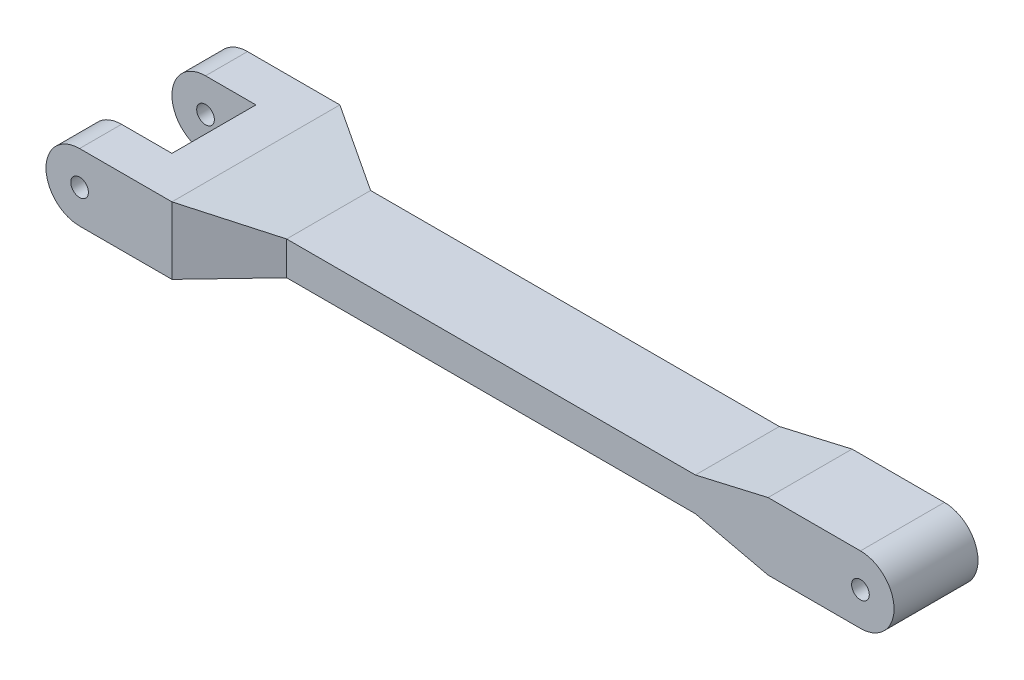
ISO-10303-21;
HEADER;
FILE_DESCRIPTION(('STEP AP214'),'2;1');
FILE_NAME('part.step','',(''),(''),'','','');
FILE_SCHEMA(('AUTOMOTIVE_DESIGN { 1 0 10303 214 1 1 1 1 }'));
ENDSEC;
DATA;
#1=APPLICATION_CONTEXT('core data for automotive mechanical design processes');
#2=APPLICATION_PROTOCOL_DEFINITION('international standard','automotive_design',2000,#1);
#3=PRODUCT_CONTEXT('',#1,'mechanical');
#4=PRODUCT('Part','Part','',(#3));
#5=PRODUCT_RELATED_PRODUCT_CATEGORY('part','',(#4));
#6=PRODUCT_DEFINITION_FORMATION('','',#4);
#7=PRODUCT_DEFINITION_CONTEXT('part definition',#1,'design');
#8=PRODUCT_DEFINITION('design','',#6,#7);
#9=PRODUCT_DEFINITION_SHAPE('','',#8);
#10=(LENGTH_UNIT() NAMED_UNIT(*) SI_UNIT(.MILLI.,.METRE.));
#11=(NAMED_UNIT(*) PLANE_ANGLE_UNIT() SI_UNIT($,.RADIAN.));
#12=(NAMED_UNIT(*) SI_UNIT($,.STERADIAN.) SOLID_ANGLE_UNIT());
#13=UNCERTAINTY_MEASURE_WITH_UNIT(LENGTH_MEASURE(1.E-05),#10,'distance_accuracy_value','');
#14=(GEOMETRIC_REPRESENTATION_CONTEXT(3) GLOBAL_UNCERTAINTY_ASSIGNED_CONTEXT((#13)) GLOBAL_UNIT_ASSIGNED_CONTEXT((#10,
#11,#12)) REPRESENTATION_CONTEXT('',''));
#15=CARTESIAN_POINT('',(0.,0.,0.));
#16=DIRECTION('',(0.,0.,1.));
#17=DIRECTION('',(1.,0.,0.));
#18=AXIS2_PLACEMENT_3D('',#15,#16,#17);
#19=CARTESIAN_POINT('',(-10.7768571428571,-4.0478840909925,25.4));
#20=DIRECTION('',(0.,1.,0.));
#21=DIRECTION('',(0.,0.,1.));
#22=AXIS2_PLACEMENT_3D('',#19,#20,#21);
#23=PLANE('',#22);
#24=DIRECTION('',(0.,0.,1.));
#25=VECTOR('',#24,1.);
#26=CARTESIAN_POINT('',(3.19314285714287,-4.0478840909925,0.));
#27=LINE('',#26,#25);
#28=CARTESIAN_POINT('',(3.19314285714287,-4.0478840909925,0.));
#29=VERTEX_POINT('',#28);
#30=CARTESIAN_POINT('',(3.19314285714287,-4.0478840909925,25.4));
#31=VERTEX_POINT('',#30);
#32=EDGE_CURVE('E366',#29,#31,#27,.T.);
#33=ORIENTED_EDGE('',*,*,#32,.T.);
#34=DIRECTION('',(1.,0.,0.));
#35=VECTOR('',#34,1.);
#36=CARTESIAN_POINT('',(-10.7768571428571,-4.0478840909925,25.4));
#37=LINE('',#36,#35);
#38=CARTESIAN_POINT('',(-10.7768571428571,-4.0478840909925,25.4));
#39=VERTEX_POINT('',#38);
#40=EDGE_CURVE('E202',#39,#31,#37,.T.);
#41=ORIENTED_EDGE('',*,*,#40,.F.);
#42=DIRECTION('',(0.,0.,-1.));
#43=VECTOR('',#42,1.);
#44=CARTESIAN_POINT('',(-10.7768571428571,-4.0478840909925,25.4));
#45=LINE('',#44,#43);
#46=CARTESIAN_POINT('',(-10.7768571428571,-4.0478840909925,19.05));
#47=VERTEX_POINT('',#46);
#48=EDGE_CURVE('E221',#39,#47,#45,.T.);
#49=ORIENTED_EDGE('',*,*,#48,.T.);
#50=DIRECTION('',(1.,0.,0.));
#51=VECTOR('',#50,1.);
#52=CARTESIAN_POINT('',(-10.7768571428571,-4.0478840909925,19.05));
#53=LINE('',#52,#51);
#54=CARTESIAN_POINT('',(-3.15685714285714,-4.0478840909925,19.05));
#55=VERTEX_POINT('',#54);
#56=EDGE_CURVE('E236',#47,#55,#53,.T.);
#57=ORIENTED_EDGE('',*,*,#56,.T.);
#58=DIRECTION('',(0.,0.,-1.));
#59=VECTOR('',#58,1.);
#60=CARTESIAN_POINT('',(-3.15685714285714,-4.0478840909925,25.4));
#61=LINE('',#60,#59);
#62=CARTESIAN_POINT('',(-3.15685714285715,-4.0478840909925,6.35));
#63=VERTEX_POINT('',#62);
#64=EDGE_CURVE('E328',#55,#63,#61,.T.);
#65=ORIENTED_EDGE('',*,*,#64,.T.);
#66=DIRECTION('',(-1.,0.,0.));
#67=VECTOR('',#66,1.);
#68=CARTESIAN_POINT('',(-10.7768571428571,-4.0478840909925,6.35));
#69=LINE('',#68,#67);
#70=CARTESIAN_POINT('',(-10.7768571428571,-4.0478840909925,6.35));
#71=VERTEX_POINT('',#70);
#72=EDGE_CURVE('E230',#63,#71,#69,.T.);
#73=ORIENTED_EDGE('',*,*,#72,.T.);
#74=CARTESIAN_POINT('',(-10.7768571428571,-4.0478840909925,0.));
#75=VERTEX_POINT('',#74);
#76=EDGE_CURVE('E220',#71,#75,#45,.T.);
#77=ORIENTED_EDGE('',*,*,#76,.T.);
#78=DIRECTION('',(1.,0.,0.));
#79=VECTOR('',#78,1.);
#80=CARTESIAN_POINT('',(-10.7768571428571,-4.0478840909925,0.));
#81=LINE('',#80,#79);
#82=EDGE_CURVE('E197',#75,#29,#81,.T.);
#83=ORIENTED_EDGE('',*,*,#82,.T.);
#84=EDGE_LOOP('',(#33,#41,#49,#57,#65,#73,#77,#83));
#85=FACE_BOUND('',#84,.T.);
#86=ADVANCED_FACE('F42',(#85),#23,.F.);
#87=CARTESIAN_POINT('',(-10.7768571428571,6.1121159090075,25.4));
#88=DIRECTION('',(0.,-1.,0.));
#89=DIRECTION('',(0.,0.,-1.));
#90=AXIS2_PLACEMENT_3D('',#87,#88,#89);
#91=PLANE('',#90);
#92=DIRECTION('',(0.,0.,1.));
#93=VECTOR('',#92,1.);
#94=CARTESIAN_POINT('',(87.0131428571429,6.1121159090075,0.));
#95=LINE('',#94,#93);
#96=CARTESIAN_POINT('',(87.0131428571429,6.1121159090075,6.35));
#97=VERTEX_POINT('',#96);
#98=CARTESIAN_POINT('',(87.0131428571429,6.1121159090075,19.05));
#99=VERTEX_POINT('',#98);
#100=EDGE_CURVE('E177',#97,#99,#95,.T.);
#101=ORIENTED_EDGE('',*,*,#100,.T.);
#102=DIRECTION('',(-1.,0.,0.));
#103=VECTOR('',#102,1.);
#104=CARTESIAN_POINT('',(-10.7768571428571,6.1121159090075,19.05));
#105=LINE('',#104,#103);
#106=CARTESIAN_POINT('',(100.983142857143,6.1121159090075,19.05));
#107=VERTEX_POINT('',#106);
#108=EDGE_CURVE('E248',#107,#99,#105,.T.);
#109=ORIENTED_EDGE('',*,*,#108,.F.);
#110=DIRECTION('',(0.,0.,-1.));
#111=VECTOR('',#110,1.);
#112=CARTESIAN_POINT('',(100.983142857143,6.1121159090075,25.4));
#113=LINE('',#112,#111);
#114=CARTESIAN_POINT('',(100.983142857143,6.1121159090075,6.35));
#115=VERTEX_POINT('',#114);
#116=EDGE_CURVE('E211',#107,#115,#113,.T.);
#117=ORIENTED_EDGE('',*,*,#116,.T.);
#118=DIRECTION('',(-1.,0.,0.));
#119=VECTOR('',#118,1.);
#120=CARTESIAN_POINT('',(-10.7768571428571,6.1121159090075,6.35));
#121=LINE('',#120,#119);
#122=EDGE_CURVE('E242',#115,#97,#121,.T.);
#123=ORIENTED_EDGE('',*,*,#122,.T.);
#124=EDGE_LOOP('',(#101,#109,#117,#123));
#125=FACE_BOUND('',#124,.T.);
#126=ADVANCED_FACE('F421',(#125),#91,.F.);
#127=CARTESIAN_POINT('',(0.79828571428571,-4.0478840909925,-1.38267141609927));
#128=DIRECTION('',(-0.499999999999998,0.,0.86602540378444));
#129=DIRECTION('',(0.86602540378444,0.,0.499999999999998));
#130=AXIS2_PLACEMENT_3D('',#127,#128,#129);
#131=PLANE('',#130);
#132=DIRECTION('',(0.,1.,0.));
#133=VECTOR('',#132,1.);
#134=CARTESIAN_POINT('',(3.19314285714287,-4.0478840909925,0.));
#135=LINE('',#134,#133);
#136=CARTESIAN_POINT('',(3.19314285714287,6.1121159090075,0.));
#137=VERTEX_POINT('',#136);
#138=EDGE_CURVE('E181',#29,#137,#135,.T.);
#139=ORIENTED_EDGE('',*,*,#138,.T.);
#140=DIRECTION('',(0.849207775608447,-0.196116135138187,0.490290337845458));
#141=VECTOR('',#140,1.);
#142=CARTESIAN_POINT('',(2.58247600871292,6.25314337673799,-0.352568669326211));
#143=LINE('',#142,#141);
#144=CARTESIAN_POINT('',(14.1916654852051,3.5721159090075,6.35));
#145=VERTEX_POINT('',#144);
#146=EDGE_CURVE('E154',#137,#145,#143,.T.);
#147=ORIENTED_EDGE('',*,*,#146,.T.);
#148=DIRECTION('',(0.,1.,0.));
#149=VECTOR('',#148,1.);
#150=CARTESIAN_POINT('',(14.1916654852053,-4.0478840909925,6.35));
#151=LINE('',#150,#149);
#152=CARTESIAN_POINT('',(14.1916654852051,-1.5078840909925,6.35));
#153=VERTEX_POINT('',#152);
#154=EDGE_CURVE('E188',#153,#145,#151,.T.);
#155=ORIENTED_EDGE('',*,*,#154,.F.);
#156=DIRECTION('',(0.849207775608447,0.196116135138187,0.490290337845458));
#157=VECTOR('',#156,1.);
#158=CARTESIAN_POINT('',(0.890395604395603,-4.57968078949223,-1.3294917462493));
#159=LINE('',#158,#157);
#160=EDGE_CURVE('E165',#29,#153,#159,.T.);
#161=ORIENTED_EDGE('',*,*,#160,.F.);
#162=EDGE_LOOP('',(#139,#147,#155,#161));
#163=FACE_BOUND('',#162,.T.);
#164=ADVANCED_FACE('F182',(#163),#131,.F.);
#165=CARTESIAN_POINT('',(0.,-4.0478840909925,6.35));
#166=DIRECTION('',(0.,0.,1.));
#167=DIRECTION('',(1.,0.,0.));
#168=AXIS2_PLACEMENT_3D('',#165,#166,#167);
#169=PLANE('',#168);
#170=CARTESIAN_POINT('',(100.983142857143,1.0321159090075,6.35));
#171=DIRECTION('',(0.,0.,1.));
#172=DIRECTION('',(1.,0.,0.));
#173=AXIS2_PLACEMENT_3D('',#170,#171,#172);
#174=CIRCLE('',#173,1.3375);
#175=CARTESIAN_POINT('',(102.320642857143,1.0321159090075,6.35));
#176=VERTEX_POINT('',#175);
#177=EDGE_CURVE('E238',#176,#176,#174,.T.);
#178=ORIENTED_EDGE('',*,*,#177,.T.);
#179=EDGE_LOOP('',(#178));
#180=FACE_BOUND('',#179,.T.);
#181=DIRECTION('',(-0.974354703692446,-0.225017580185208,0.));
#182=VECTOR('',#181,1.);
#183=CARTESIAN_POINT('',(2.1781798655643,-13.4796795789447,6.35));
#184=LINE('',#183,#182);
#185=CARTESIAN_POINT('',(76.0146202290806,3.5721159090075,6.35));
#186=VERTEX_POINT('',#185);
#187=EDGE_CURVE('E394',#97,#186,#184,.T.);
#188=ORIENTED_EDGE('',*,*,#187,.F.);
#189=ORIENTED_EDGE('',*,*,#122,.F.);
#190=CARTESIAN_POINT('',(100.983142857143,1.0321159090075,6.35));
#191=DIRECTION('',(0.,0.,1.));
#192=DIRECTION('',(1.,0.,0.));
#193=AXIS2_PLACEMENT_3D('',#190,#191,#192);
#194=CIRCLE('',#193,5.08);
#195=CARTESIAN_POINT('',(100.983142857143,-4.0478840909925,6.35));
#196=VERTEX_POINT('',#195);
#197=EDGE_CURVE('E249',#196,#115,#194,.T.);
#198=ORIENTED_EDGE('',*,*,#197,.F.);
#199=DIRECTION('',(1.,0.,0.));
#200=VECTOR('',#199,1.);
#201=CARTESIAN_POINT('',(0.,-4.0478840909925,6.35));
#202=LINE('',#201,#200);
#203=CARTESIAN_POINT('',(87.0131428571429,-4.0478840909925,6.35));
#204=VERTEX_POINT('',#203);
#205=EDGE_CURVE('E164',#204,#196,#202,.T.);
#206=ORIENTED_EDGE('',*,*,#205,.F.);
#207=DIRECTION('',(-0.974354703692446,0.225017580185208,0.));
#208=VECTOR('',#207,1.);
#209=CARTESIAN_POINT('',(4.40572875226051,15.0294810172128,6.35));
#210=LINE('',#209,#208);
#211=CARTESIAN_POINT('',(76.0146202290806,-1.5078840909925,6.35));
#212=VERTEX_POINT('',#211);
#213=EDGE_CURVE('E382',#204,#212,#210,.T.);
#214=ORIENTED_EDGE('',*,*,#213,.T.);
#215=DIRECTION('',(1.,0.,0.));
#216=VECTOR('',#215,1.);
#217=CARTESIAN_POINT('',(0.,-1.5078840909925,6.35));
#218=LINE('',#217,#216);
#219=EDGE_CURVE('E386',#153,#212,#218,.T.);
#220=ORIENTED_EDGE('',*,*,#219,.F.);
#221=ORIENTED_EDGE('',*,*,#154,.T.);
#222=DIRECTION('',(1.,0.,0.));
#223=VECTOR('',#222,1.);
#224=CARTESIAN_POINT('',(0.,3.5721159090075,6.35));
#225=LINE('',#224,#223);
#226=EDGE_CURVE('E390',#145,#186,#225,.T.);
#227=ORIENTED_EDGE('',*,*,#226,.T.);
#228=EDGE_LOOP('',(#188,#189,#198,#206,#214,#220,#221,#227));
#229=FACE_BOUND('',#228,.T.);
#230=ADVANCED_FACE('F406',(#180,#229),#169,.F.);
#231=CARTESIAN_POINT('',(11.7968083423482,-4.0478840909925,20.4326714160992));
#232=DIRECTION('',(0.500000000000005,0.,0.866025403784436));
#233=DIRECTION('',(0.866025403784436,0.,-0.500000000000005));
#234=AXIS2_PLACEMENT_3D('',#231,#232,#233);
#235=PLANE('',#234);
#236=DIRECTION('',(0.849207775608444,-0.196116135138186,-0.490290337845465));
#237=VECTOR('',#236,1.);
#238=CARTESIAN_POINT('',(13.157978535696,3.81083568443025,19.6467994385569));
#239=LINE('',#238,#237);
#240=CARTESIAN_POINT('',(3.19314285714287,6.1121159090075,25.4));
#241=VERTEX_POINT('',#240);
#242=CARTESIAN_POINT('',(14.1916654852051,3.5721159090075,19.05));
#243=VERTEX_POINT('',#242);
#244=EDGE_CURVE('E12',#241,#243,#239,.T.);
#245=ORIENTED_EDGE('',*,*,#244,.F.);
#246=DIRECTION('',(0.,1.,0.));
#247=VECTOR('',#246,1.);
#248=CARTESIAN_POINT('',(3.19314285714287,-4.0478840909925,25.4));
#249=LINE('',#248,#247);
#250=EDGE_CURVE('E243',#31,#241,#249,.T.);
#251=ORIENTED_EDGE('',*,*,#250,.F.);
#252=DIRECTION('',(0.849207775608444,0.196116135138186,-0.490290337845465));
#253=VECTOR('',#252,1.);
#254=CARTESIAN_POINT('',(11.4658981313787,-2.13737309718449,20.62372251548));
#255=LINE('',#254,#253);
#256=CARTESIAN_POINT('',(14.1916654852051,-1.5078840909925,19.05));
#257=VERTEX_POINT('',#256);
#258=EDGE_CURVE('E51',#31,#257,#255,.T.);
#259=ORIENTED_EDGE('',*,*,#258,.T.);
#260=DIRECTION('',(0.,1.,0.));
#261=VECTOR('',#260,1.);
#262=CARTESIAN_POINT('',(14.1916654852051,-4.0478840909925,19.05));
#263=LINE('',#262,#261);
#264=EDGE_CURVE('E269',#257,#243,#263,.T.);
#265=ORIENTED_EDGE('',*,*,#264,.T.);
#266=EDGE_LOOP('',(#245,#251,#259,#265));
#267=FACE_BOUND('',#266,.T.);
#268=ADVANCED_FACE('F268',(#267),#235,.T.);
#269=CARTESIAN_POINT('',(0.,-4.0478840909925,19.05));
#270=DIRECTION('',(0.,0.,1.));
#271=DIRECTION('',(1.,0.,0.));
#272=AXIS2_PLACEMENT_3D('',#269,#270,#271);
#273=PLANE('',#272);
#274=CARTESIAN_POINT('',(100.983142857143,1.0321159090075,19.05));
#275=DIRECTION('',(0.,0.,1.));
#276=DIRECTION('',(1.,0.,0.));
#277=AXIS2_PLACEMENT_3D('',#274,#275,#276);
#278=CIRCLE('',#277,1.3375);
#279=CARTESIAN_POINT('',(102.320642857143,1.0321159090075,19.05));
#280=VERTEX_POINT('',#279);
#281=EDGE_CURVE('E244',#280,#280,#278,.T.);
#282=ORIENTED_EDGE('',*,*,#281,.F.);
#283=EDGE_LOOP('',(#282));
#284=FACE_BOUND('',#283,.T.);
#285=ORIENTED_EDGE('',*,*,#108,.T.);
#286=DIRECTION('',(-0.974354703692446,-0.225017580185208,0.));
#287=VECTOR('',#286,1.);
#288=CARTESIAN_POINT('',(2.1781798655643,-13.4796795789447,19.05));
#289=LINE('',#288,#287);
#290=CARTESIAN_POINT('',(76.0146202290806,3.5721159090075,19.05));
#291=VERTEX_POINT('',#290);
#292=EDGE_CURVE('E259',#99,#291,#289,.T.);
#293=ORIENTED_EDGE('',*,*,#292,.T.);
#294=DIRECTION('',(1.,0.,0.));
#295=VECTOR('',#294,1.);
#296=CARTESIAN_POINT('',(0.,3.5721159090075,19.05));
#297=LINE('',#296,#295);
#298=EDGE_CURVE('E256',#243,#291,#297,.T.);
#299=ORIENTED_EDGE('',*,*,#298,.F.);
#300=ORIENTED_EDGE('',*,*,#264,.F.);
#301=DIRECTION('',(1.,0.,0.));
#302=VECTOR('',#301,1.);
#303=CARTESIAN_POINT('',(0.,-1.5078840909925,19.05));
#304=LINE('',#303,#302);
#305=CARTESIAN_POINT('',(76.0146202290806,-1.5078840909925,19.05));
#306=VERTEX_POINT('',#305);
#307=EDGE_CURVE('E252',#257,#306,#304,.T.);
#308=ORIENTED_EDGE('',*,*,#307,.T.);
#309=DIRECTION('',(-0.974354703692446,0.225017580185208,0.));
#310=VECTOR('',#309,1.);
#311=CARTESIAN_POINT('',(4.40572875226051,15.0294810172128,19.05));
#312=LINE('',#311,#310);
#313=CARTESIAN_POINT('',(87.0131428571428,-4.0478840909925,19.05));
#314=VERTEX_POINT('',#313);
#315=EDGE_CURVE('E225',#314,#306,#312,.T.);
#316=ORIENTED_EDGE('',*,*,#315,.F.);
#317=DIRECTION('',(1.,0.,0.));
#318=VECTOR('',#317,1.);
#319=CARTESIAN_POINT('',(0.,-4.0478840909925,19.05));
#320=LINE('',#319,#318);
#321=CARTESIAN_POINT('',(100.983142857143,-4.0478840909925,19.05));
#322=VERTEX_POINT('',#321);
#323=EDGE_CURVE('E187',#314,#322,#320,.T.);
#324=ORIENTED_EDGE('',*,*,#323,.T.);
#325=CARTESIAN_POINT('',(100.983142857143,1.0321159090075,19.05));
#326=DIRECTION('',(0.,0.,1.));
#327=DIRECTION('',(1.,0.,0.));
#328=AXIS2_PLACEMENT_3D('',#325,#326,#327);
#329=CIRCLE('',#328,5.08);
#330=EDGE_CURVE('E297',#322,#107,#329,.T.);
#331=ORIENTED_EDGE('',*,*,#330,.T.);
#332=EDGE_LOOP('',(#285,#293,#299,#300,#308,#316,#324,#331));
#333=FACE_BOUND('',#332,.T.);
#334=ADVANCED_FACE('F278',(#284,#333),#273,.T.);
#335=CARTESIAN_POINT('',(-10.7768571428571,1.0321159090075,25.4));
#336=DIRECTION('',(0.,0.,1.));
#337=DIRECTION('',(1.,0.,0.));
#338=AXIS2_PLACEMENT_3D('',#335,#336,#337);
#339=PLANE('',#338);
#340=CARTESIAN_POINT('',(-10.7768571428571,1.0321159090075,25.4));
#341=DIRECTION('',(0.,0.,1.));
#342=DIRECTION('',(1.,0.,0.));
#343=AXIS2_PLACEMENT_3D('',#340,#341,#342);
#344=CIRCLE('',#343,1.3375);
#345=CARTESIAN_POINT('',(-9.43935714285714,1.0321159090075,25.4));
#346=VERTEX_POINT('',#345);
#347=EDGE_CURVE('E333',#346,#346,#344,.T.);
#348=ORIENTED_EDGE('',*,*,#347,.F.);
#349=EDGE_LOOP('',(#348));
#350=FACE_BOUND('',#349,.T.);
#351=ORIENTED_EDGE('',*,*,#40,.T.);
#352=ORIENTED_EDGE('',*,*,#250,.T.);
#353=DIRECTION('',(-1.,0.,0.));
#354=VECTOR('',#353,1.);
#355=CARTESIAN_POINT('',(-10.7768571428571,6.1121159090075,25.4));
#356=LINE('',#355,#354);
#357=CARTESIAN_POINT('',(-10.7768571428571,6.1121159090075,25.4));
#358=VERTEX_POINT('',#357);
#359=EDGE_CURVE('E175',#241,#358,#356,.T.);
#360=ORIENTED_EDGE('',*,*,#359,.T.);
#361=CARTESIAN_POINT('',(-10.7768571428571,1.0321159090075,25.4));
#362=DIRECTION('',(0.,0.,1.));
#363=DIRECTION('',(1.,0.,0.));
#364=AXIS2_PLACEMENT_3D('',#361,#362,#363);
#365=CIRCLE('',#364,5.08);
#366=EDGE_CURVE('E196',#358,#39,#365,.T.);
#367=ORIENTED_EDGE('',*,*,#366,.T.);
#368=EDGE_LOOP('',(#351,#352,#360,#367));
#369=FACE_BOUND('',#368,.T.);
#370=ADVANCED_FACE('F365',(#350,#369),#339,.T.);
#371=ORIENTED_EDGE('',*,*,#323,.F.);
#372=DIRECTION('',(0.,0.,1.));
#373=VECTOR('',#372,1.);
#374=CARTESIAN_POINT('',(87.0131428571429,-4.0478840909925,0.));
#375=LINE('',#374,#373);
#376=EDGE_CURVE('E58',#204,#314,#375,.T.);
#377=ORIENTED_EDGE('',*,*,#376,.F.);
#378=ORIENTED_EDGE('',*,*,#205,.T.);
#379=DIRECTION('',(0.,0.,-1.));
#380=VECTOR('',#379,1.);
#381=CARTESIAN_POINT('',(100.983142857143,-4.0478840909925,25.4));
#382=LINE('',#381,#380);
#383=EDGE_CURVE('E216',#322,#196,#382,.T.);
#384=ORIENTED_EDGE('',*,*,#383,.F.);
#385=EDGE_LOOP('',(#371,#377,#378,#384));
#386=FACE_BOUND('',#385,.T.);
#387=ADVANCED_FACE('F412',(#386),#23,.F.);
#388=CARTESIAN_POINT('',(100.983142857143,1.0321159090075,25.4));
#389=DIRECTION('',(0.,0.,-1.));
#390=DIRECTION('',(-1.,0.,0.));
#391=AXIS2_PLACEMENT_3D('',#388,#389,#390);
#392=CYLINDRICAL_SURFACE('',#391,5.08);
#393=ORIENTED_EDGE('',*,*,#116,.F.);
#394=ORIENTED_EDGE('',*,*,#330,.F.);
#395=ORIENTED_EDGE('',*,*,#383,.T.);
#396=ORIENTED_EDGE('',*,*,#197,.T.);
#397=EDGE_LOOP('',(#393,#394,#395,#396));
#398=FACE_BOUND('',#397,.T.);
#399=ADVANCED_FACE('F418',(#398),#392,.T.);
#400=ORIENTED_EDGE('',*,*,#359,.F.);
#401=DIRECTION('',(0.,0.,1.));
#402=VECTOR('',#401,1.);
#403=CARTESIAN_POINT('',(3.19314285714287,6.1121159090075,0.));
#404=LINE('',#403,#402);
#405=EDGE_CURVE('E157',#137,#241,#404,.T.);
#406=ORIENTED_EDGE('',*,*,#405,.F.);
#407=DIRECTION('',(-1.,0.,0.));
#408=VECTOR('',#407,1.);
#409=CARTESIAN_POINT('',(-10.7768571428571,6.1121159090075,0.));
#410=LINE('',#409,#408);
#411=CARTESIAN_POINT('',(-10.7768571428571,6.1121159090075,0.));
#412=VERTEX_POINT('',#411);
#413=EDGE_CURVE('E172',#137,#412,#410,.T.);
#414=ORIENTED_EDGE('',*,*,#413,.T.);
#415=DIRECTION('',(0.,0.,-1.));
#416=VECTOR('',#415,1.);
#417=CARTESIAN_POINT('',(-10.7768571428571,6.1121159090075,25.4));
#418=LINE('',#417,#416);
#419=CARTESIAN_POINT('',(-10.7768571428571,6.1121159090075,6.35));
#420=VERTEX_POINT('',#419);
#421=EDGE_CURVE('E212',#420,#412,#418,.T.);
#422=ORIENTED_EDGE('',*,*,#421,.F.);
#423=DIRECTION('',(-1.,0.,0.));
#424=VECTOR('',#423,1.);
#425=CARTESIAN_POINT('',(-3.15685714285715,6.1121159090075,6.35));
#426=LINE('',#425,#424);
#427=CARTESIAN_POINT('',(-3.15685714285715,6.1121159090075,6.35));
#428=VERTEX_POINT('',#427);
#429=EDGE_CURVE('E303',#428,#420,#426,.T.);
#430=ORIENTED_EDGE('',*,*,#429,.F.);
#431=DIRECTION('',(0.,0.,-1.));
#432=VECTOR('',#431,1.);
#433=CARTESIAN_POINT('',(-3.15685714285715,6.1121159090075,6.35));
#434=LINE('',#433,#432);
#435=CARTESIAN_POINT('',(-3.15685714285714,6.1121159090075,19.05));
#436=VERTEX_POINT('',#435);
#437=EDGE_CURVE('E300',#436,#428,#434,.T.);
#438=ORIENTED_EDGE('',*,*,#437,.F.);
#439=DIRECTION('',(1.,0.,0.));
#440=VECTOR('',#439,1.);
#441=CARTESIAN_POINT('',(-3.15685714285714,6.1121159090075,19.05));
#442=LINE('',#441,#440);
#443=CARTESIAN_POINT('',(-10.7768571428571,6.1121159090075,19.05));
#444=VERTEX_POINT('',#443);
#445=EDGE_CURVE('E307',#444,#436,#442,.T.);
#446=ORIENTED_EDGE('',*,*,#445,.F.);
#447=EDGE_CURVE('E207',#358,#444,#418,.T.);
#448=ORIENTED_EDGE('',*,*,#447,.F.);
#449=EDGE_LOOP('',(#400,#406,#414,#422,#430,#438,#446,#448));
#450=FACE_BOUND('',#449,.T.);
#451=ADVANCED_FACE('F169',(#450),#91,.F.);
#452=CARTESIAN_POINT('',(-10.7768571428571,1.0321159090075,25.4));
#453=DIRECTION('',(0.,0.,-1.));
#454=DIRECTION('',(-1.,0.,0.));
#455=AXIS2_PLACEMENT_3D('',#452,#453,#454);
#456=CYLINDRICAL_SURFACE('',#455,5.08);
#457=ORIENTED_EDGE('',*,*,#447,.T.);
#458=CARTESIAN_POINT('',(-10.7768571428571,1.0321159090075,19.05));
#459=DIRECTION('',(0.,0.,1.));
#460=DIRECTION('',(1.,0.,0.));
#461=AXIS2_PLACEMENT_3D('',#458,#459,#460);
#462=CIRCLE('',#461,5.08);
#463=EDGE_CURVE('E325',#444,#47,#462,.T.);
#464=ORIENTED_EDGE('',*,*,#463,.T.);
#465=ORIENTED_EDGE('',*,*,#48,.F.);
#466=ORIENTED_EDGE('',*,*,#366,.F.);
#467=EDGE_LOOP('',(#457,#464,#465,#466));
#468=FACE_BOUND('',#467,.T.);
#469=ADVANCED_FACE('F361',(#468),#456,.T.);
#470=CARTESIAN_POINT('',(-10.7768571428571,1.0321159090075,25.4));
#471=DIRECTION('',(0.,0.,-1.));
#472=DIRECTION('',(-1.,0.,0.));
#473=AXIS2_PLACEMENT_3D('',#470,#471,#472);
#474=CYLINDRICAL_SURFACE('',#473,1.3375);
#475=CARTESIAN_POINT('',(-10.7768571428571,1.0321159090075,19.05));
#476=DIRECTION('',(0.,0.,1.));
#477=DIRECTION('',(1.,0.,0.));
#478=AXIS2_PLACEMENT_3D('',#475,#476,#477);
#479=CIRCLE('',#478,1.3375);
#480=CARTESIAN_POINT('',(-9.43935714285714,1.0321159090075,19.05));
#481=VERTEX_POINT('',#480);
#482=EDGE_CURVE('E232',#481,#481,#479,.T.);
#483=ORIENTED_EDGE('',*,*,#482,.F.);
#484=EDGE_LOOP('',(#483));
#485=FACE_BOUND('',#484,.T.);
#486=ORIENTED_EDGE('',*,*,#347,.T.);
#487=EDGE_LOOP('',(#486));
#488=FACE_BOUND('',#487,.T.);
#489=ADVANCED_FACE('F462',(#485,#488),#474,.F.);
#490=CARTESIAN_POINT('',(-10.7768571428571,1.0321159090075,0.));
#491=DIRECTION('',(0.,0.,1.));
#492=DIRECTION('',(1.,0.,0.));
#493=AXIS2_PLACEMENT_3D('',#490,#491,#492);
#494=PLANE('',#493);
#495=ORIENTED_EDGE('',*,*,#413,.F.);
#496=ORIENTED_EDGE('',*,*,#138,.F.);
#497=ORIENTED_EDGE('',*,*,#82,.F.);
#498=CARTESIAN_POINT('',(-10.7768571428571,1.0321159090075,0.));
#499=DIRECTION('',(0.,0.,1.));
#500=DIRECTION('',(1.,0.,0.));
#501=AXIS2_PLACEMENT_3D('',#498,#499,#500);
#502=CIRCLE('',#501,5.08);
#503=EDGE_CURVE('E194',#412,#75,#502,.T.);
#504=ORIENTED_EDGE('',*,*,#503,.F.);
#505=EDGE_LOOP('',(#495,#496,#497,#504));
#506=FACE_BOUND('',#505,.T.);
#507=CARTESIAN_POINT('',(-10.7768571428571,1.0321159090075,0.));
#508=DIRECTION('',(0.,0.,1.));
#509=DIRECTION('',(1.,0.,0.));
#510=AXIS2_PLACEMENT_3D('',#507,#508,#509);
#511=CIRCLE('',#510,1.3375);
#512=CARTESIAN_POINT('',(-9.43935714285714,1.0321159090075,0.));
#513=VERTEX_POINT('',#512);
#514=EDGE_CURVE('E332',#513,#513,#511,.T.);
#515=ORIENTED_EDGE('',*,*,#514,.T.);
#516=EDGE_LOOP('',(#515));
#517=FACE_BOUND('',#516,.T.);
#518=ADVANCED_FACE('F191',(#506,#517),#494,.F.);
#519=CARTESIAN_POINT('',(-10.7768571428571,1.0321159090075,6.35));
#520=DIRECTION('',(0.,0.,-1.));
#521=DIRECTION('',(-1.,0.,0.));
#522=AXIS2_PLACEMENT_3D('',#519,#520,#521);
#523=CIRCLE('',#522,5.08);
#524=EDGE_CURVE('E237',#71,#420,#523,.T.);
#525=ORIENTED_EDGE('',*,*,#524,.T.);
#526=ORIENTED_EDGE('',*,*,#421,.T.);
#527=ORIENTED_EDGE('',*,*,#503,.T.);
#528=ORIENTED_EDGE('',*,*,#76,.F.);
#529=EDGE_LOOP('',(#525,#526,#527,#528));
#530=FACE_BOUND('',#529,.T.);
#531=ADVANCED_FACE('F44',(#530),#456,.T.);
#532=CARTESIAN_POINT('',(-10.7768571428571,1.0321159090075,6.35));
#533=DIRECTION('',(0.,0.,-1.));
#534=DIRECTION('',(-1.,0.,0.));
#535=AXIS2_PLACEMENT_3D('',#532,#533,#534);
#536=CIRCLE('',#535,1.3375);
#537=CARTESIAN_POINT('',(-12.1143571428571,1.0321159090075,6.35));
#538=VERTEX_POINT('',#537);
#539=EDGE_CURVE('E226',#538,#538,#536,.T.);
#540=ORIENTED_EDGE('',*,*,#539,.F.);
#541=EDGE_LOOP('',(#540));
#542=FACE_BOUND('',#541,.T.);
#543=ORIENTED_EDGE('',*,*,#514,.F.);
#544=EDGE_LOOP('',(#543));
#545=FACE_BOUND('',#544,.T.);
#546=ADVANCED_FACE('F459',(#542,#545),#474,.F.);
#547=CARTESIAN_POINT('',(-3.15685714285715,-6.5878840909925,6.35));
#548=DIRECTION('',(1.,0.,0.));
#549=DIRECTION('',(0.,0.,-1.));
#550=AXIS2_PLACEMENT_3D('',#547,#548,#549);
#551=PLANE('',#550);
#552=DIRECTION('',(0.,1.,0.));
#553=VECTOR('',#552,1.);
#554=CARTESIAN_POINT('',(-3.15685714285714,-6.5878840909925,19.05));
#555=LINE('',#554,#553);
#556=EDGE_CURVE('E231',#55,#436,#555,.T.);
#557=ORIENTED_EDGE('',*,*,#556,.T.);
#558=ORIENTED_EDGE('',*,*,#437,.T.);
#559=DIRECTION('',(0.,1.,0.));
#560=VECTOR('',#559,1.);
#561=CARTESIAN_POINT('',(-3.15685714285715,-6.5878840909925,6.35));
#562=LINE('',#561,#560);
#563=EDGE_CURVE('E311',#63,#428,#562,.T.);
#564=ORIENTED_EDGE('',*,*,#563,.F.);
#565=ORIENTED_EDGE('',*,*,#64,.F.);
#566=EDGE_LOOP('',(#557,#558,#564,#565));
#567=FACE_BOUND('',#566,.T.);
#568=ADVANCED_FACE('F354',(#567),#551,.F.);
#569=CARTESIAN_POINT('',(-3.15685714285714,-6.5878840909925,19.05));
#570=DIRECTION('',(0.,0.,1.));
#571=DIRECTION('',(1.,0.,0.));
#572=AXIS2_PLACEMENT_3D('',#569,#570,#571);
#573=PLANE('',#572);
#574=ORIENTED_EDGE('',*,*,#482,.T.);
#575=EDGE_LOOP('',(#574));
#576=FACE_BOUND('',#575,.T.);
#577=ORIENTED_EDGE('',*,*,#445,.T.);
#578=ORIENTED_EDGE('',*,*,#556,.F.);
#579=ORIENTED_EDGE('',*,*,#56,.F.);
#580=ORIENTED_EDGE('',*,*,#463,.F.);
#581=EDGE_LOOP('',(#577,#578,#579,#580));
#582=FACE_BOUND('',#581,.T.);
#583=ADVANCED_FACE('F479',(#576,#582),#573,.F.);
#584=CARTESIAN_POINT('',(-3.15685714285715,-6.5878840909925,6.35));
#585=DIRECTION('',(0.,0.,-1.));
#586=DIRECTION('',(-1.,0.,0.));
#587=AXIS2_PLACEMENT_3D('',#584,#585,#586);
#588=PLANE('',#587);
#589=ORIENTED_EDGE('',*,*,#539,.T.);
#590=EDGE_LOOP('',(#589));
#591=FACE_BOUND('',#590,.T.);
#592=ORIENTED_EDGE('',*,*,#524,.F.);
#593=ORIENTED_EDGE('',*,*,#72,.F.);
#594=ORIENTED_EDGE('',*,*,#563,.T.);
#595=ORIENTED_EDGE('',*,*,#429,.T.);
#596=EDGE_LOOP('',(#592,#593,#594,#595));
#597=FACE_BOUND('',#596,.T.);
#598=ADVANCED_FACE('F352',(#591,#597),#588,.F.);
#599=CARTESIAN_POINT('',(100.983142857143,1.0321159090075,25.4));
#600=DIRECTION('',(0.,0.,-1.));
#601=DIRECTION('',(-1.,0.,0.));
#602=AXIS2_PLACEMENT_3D('',#599,#600,#601);
#603=CYLINDRICAL_SURFACE('',#602,1.3375);
#604=ORIENTED_EDGE('',*,*,#177,.F.);
#605=EDGE_LOOP('',(#604));
#606=FACE_BOUND('',#605,.T.);
#607=ORIENTED_EDGE('',*,*,#281,.T.);
#608=EDGE_LOOP('',(#607));
#609=FACE_BOUND('',#608,.T.);
#610=ADVANCED_FACE('F486',(#606,#609),#603,.F.);
#611=CARTESIAN_POINT('',(1.04916431032988,-4.54301472744821,0.));
#612=DIRECTION('',(0.225017580185207,-0.974354703692446,0.));
#613=DIRECTION('',(0.974354703692446,0.225017580185208,0.));
#614=AXIS2_PLACEMENT_3D('',#611,#612,#613);
#615=PLANE('',#614);
#616=ORIENTED_EDGE('',*,*,#160,.T.);
#617=DIRECTION('',(0.,0.,1.));
#618=VECTOR('',#617,1.);
#619=CARTESIAN_POINT('',(14.1916654852051,-1.5078840909925,0.));
#620=LINE('',#619,#618);
#621=EDGE_CURVE('E368',#153,#257,#620,.T.);
#622=ORIENTED_EDGE('',*,*,#621,.T.);
#623=ORIENTED_EDGE('',*,*,#258,.F.);
#624=ORIENTED_EDGE('',*,*,#32,.F.);
#625=EDGE_LOOP('',(#616,#622,#623,#624));
#626=FACE_BOUND('',#625,.T.);
#627=ADVANCED_FACE('F399',(#626),#615,.T.);
#628=CARTESIAN_POINT('',(0.,-1.5078840909925,0.));
#629=DIRECTION('',(0.,-1.,0.));
#630=DIRECTION('',(0.,0.,-1.));
#631=AXIS2_PLACEMENT_3D('',#628,#629,#630);
#632=PLANE('',#631);
#633=ORIENTED_EDGE('',*,*,#219,.T.);
#634=DIRECTION('',(0.,0.,1.));
#635=VECTOR('',#634,1.);
#636=CARTESIAN_POINT('',(76.0146202290806,-1.5078840909925,0.));
#637=LINE('',#636,#635);
#638=EDGE_CURVE('E374',#212,#306,#637,.T.);
#639=ORIENTED_EDGE('',*,*,#638,.T.);
#640=ORIENTED_EDGE('',*,*,#307,.F.);
#641=ORIENTED_EDGE('',*,*,#621,.F.);
#642=EDGE_LOOP('',(#633,#639,#640,#641));
#643=FACE_BOUND('',#642,.T.);
#644=ADVANCED_FACE('F402',(#643),#632,.T.);
#645=CARTESIAN_POINT('',(3.51824256127964,15.2344371737188,0.));
#646=DIRECTION('',(0.225017580185207,0.974354703692446,0.));
#647=DIRECTION('',(-0.974354703692446,0.225017580185208,0.));
#648=AXIS2_PLACEMENT_3D('',#645,#646,#647);
#649=PLANE('',#648);
#650=ORIENTED_EDGE('',*,*,#376,.T.);
#651=ORIENTED_EDGE('',*,*,#315,.T.);
#652=ORIENTED_EDGE('',*,*,#638,.F.);
#653=ORIENTED_EDGE('',*,*,#213,.F.);
#654=EDGE_LOOP('',(#650,#651,#652,#653));
#655=FACE_BOUND('',#654,.T.);
#656=ADVANCED_FACE('F409',(#655),#649,.F.);
#657=CARTESIAN_POINT('',(1.50174081506434,6.50272847872827,0.));
#658=DIRECTION('',(-0.225017580185207,-0.974354703692446,0.));
#659=DIRECTION('',(0.974354703692446,-0.225017580185208,0.));
#660=AXIS2_PLACEMENT_3D('',#657,#658,#659);
#661=PLANE('',#660);
#662=ORIENTED_EDGE('',*,*,#405,.T.);
#663=ORIENTED_EDGE('',*,*,#244,.T.);
#664=DIRECTION('',(0.,0.,1.));
#665=VECTOR('',#664,1.);
#666=CARTESIAN_POINT('',(14.1916654852051,3.5721159090075,0.));
#667=LINE('',#666,#665);
#668=EDGE_CURVE('E66',#145,#243,#667,.T.);
#669=ORIENTED_EDGE('',*,*,#668,.F.);
#670=ORIENTED_EDGE('',*,*,#146,.F.);
#671=EDGE_LOOP('',(#662,#663,#669,#670));
#672=FACE_BOUND('',#671,.T.);
#673=ADVANCED_FACE('F156',(#672),#661,.F.);
#674=CARTESIAN_POINT('',(3.06566605654517,-13.2747234224387,0.));
#675=DIRECTION('',(-0.225017580185207,0.974354703692446,0.));
#676=DIRECTION('',(-0.974354703692446,-0.225017580185208,0.));
#677=AXIS2_PLACEMENT_3D('',#674,#675,#676);
#678=PLANE('',#677);
#679=ORIENTED_EDGE('',*,*,#187,.T.);
#680=DIRECTION('',(0.,0.,1.));
#681=VECTOR('',#680,1.);
#682=CARTESIAN_POINT('',(76.0146202290806,3.5721159090075,0.));
#683=LINE('',#682,#681);
#684=EDGE_CURVE('E387',#186,#291,#683,.T.);
#685=ORIENTED_EDGE('',*,*,#684,.T.);
#686=ORIENTED_EDGE('',*,*,#292,.F.);
#687=ORIENTED_EDGE('',*,*,#100,.F.);
#688=EDGE_LOOP('',(#679,#685,#686,#687));
#689=FACE_BOUND('',#688,.T.);
#690=ADVANCED_FACE('F424',(#689),#678,.T.);
#691=CARTESIAN_POINT('',(0.,3.5721159090075,0.));
#692=DIRECTION('',(0.,-1.,0.));
#693=DIRECTION('',(0.,0.,-1.));
#694=AXIS2_PLACEMENT_3D('',#691,#692,#693);
#695=PLANE('',#694);
#696=ORIENTED_EDGE('',*,*,#668,.T.);
#697=ORIENTED_EDGE('',*,*,#298,.T.);
#698=ORIENTED_EDGE('',*,*,#684,.F.);
#699=ORIENTED_EDGE('',*,*,#226,.F.);
#700=EDGE_LOOP('',(#696,#697,#698,#699));
#701=FACE_BOUND('',#700,.T.);
#702=ADVANCED_FACE('F430',(#701),#695,.F.);
#703=CLOSED_SHELL('',(#86,#126,#164,#230,#268,#334,#370,#387,#399,#451,#469,#489,#518,#531,#546,
#568,#583,#598,#610,#627,#644,#656,#673,#690,#702));
#704=MANIFOLD_SOLID_BREP('B2',#703);
#705=ADVANCED_BREP_SHAPE_REPRESENTATION('',(#18,#704),#14);
#706=SHAPE_DEFINITION_REPRESENTATION(#9,#705);
ENDSEC;
END-ISO-10303-21;
